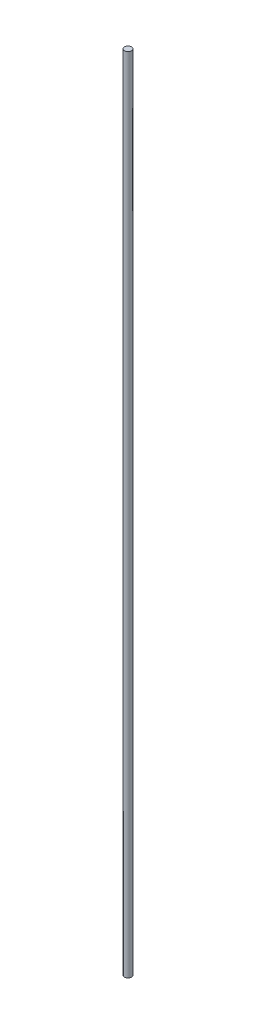
ISO-10303-21;
HEADER;
FILE_DESCRIPTION(('STEP AP214'),'2;1');
FILE_NAME('part.step','',(''),(''),'','','');
FILE_SCHEMA(('AUTOMOTIVE_DESIGN { 1 0 10303 214 1 1 1 1 }'));
ENDSEC;
DATA;
#1=APPLICATION_CONTEXT('core data for automotive mechanical design processes');
#2=APPLICATION_PROTOCOL_DEFINITION('international standard','automotive_design',2000,#1);
#3=PRODUCT_CONTEXT('',#1,'mechanical');
#4=PRODUCT('Part','Part','',(#3));
#5=PRODUCT_RELATED_PRODUCT_CATEGORY('part','',(#4));
#6=PRODUCT_DEFINITION_FORMATION('','',#4);
#7=PRODUCT_DEFINITION_CONTEXT('part definition',#1,'design');
#8=PRODUCT_DEFINITION('design','',#6,#7);
#9=PRODUCT_DEFINITION_SHAPE('','',#8);
#10=(LENGTH_UNIT() NAMED_UNIT(*) SI_UNIT(.MILLI.,.METRE.));
#11=(NAMED_UNIT(*) PLANE_ANGLE_UNIT() SI_UNIT($,.RADIAN.));
#12=(NAMED_UNIT(*) SI_UNIT($,.STERADIAN.) SOLID_ANGLE_UNIT());
#13=UNCERTAINTY_MEASURE_WITH_UNIT(LENGTH_MEASURE(1.E-05),#10,'distance_accuracy_value','');
#14=(GEOMETRIC_REPRESENTATION_CONTEXT(3) GLOBAL_UNCERTAINTY_ASSIGNED_CONTEXT((#13)) GLOBAL_UNIT_ASSIGNED_CONTEXT((#10,
#11,#12)) REPRESENTATION_CONTEXT('',''));
#15=CARTESIAN_POINT('',(0.,0.,0.));
#16=DIRECTION('',(0.,0.,1.));
#17=DIRECTION('',(1.,0.,0.));
#18=AXIS2_PLACEMENT_3D('',#15,#16,#17);
#19=CARTESIAN_POINT('',(0.,730.25,0.));
#20=DIRECTION('',(0.,-1.,0.));
#21=DIRECTION('',(0.,0.,-1.));
#22=AXIS2_PLACEMENT_3D('',#19,#20,#21);
#23=CYLINDRICAL_SURFACE('',#22,3.175);
#24=CARTESIAN_POINT('',(0.,730.25,0.));
#25=DIRECTION('',(0.,1.,0.));
#26=DIRECTION('',(0.,0.,1.));
#27=AXIS2_PLACEMENT_3D('',#24,#25,#26);
#28=CIRCLE('',#27,3.175);
#29=CARTESIAN_POINT('',(0.,730.25,3.175));
#30=VERTEX_POINT('',#29);
#31=EDGE_CURVE('E10',#30,#30,#28,.T.);
#32=ORIENTED_EDGE('',*,*,#31,.F.);
#33=EDGE_LOOP('',(#32));
#34=FACE_BOUND('',#33,.T.);
#35=CARTESIAN_POINT('',(0.,0.,0.));
#36=DIRECTION('',(0.,1.,0.));
#37=DIRECTION('',(0.,0.,1.));
#38=AXIS2_PLACEMENT_3D('',#35,#36,#37);
#39=CIRCLE('',#38,3.175);
#40=CARTESIAN_POINT('',(0.,0.,3.175));
#41=VERTEX_POINT('',#40);
#42=EDGE_CURVE('E40',#41,#41,#39,.T.);
#43=ORIENTED_EDGE('',*,*,#42,.T.);
#44=EDGE_LOOP('',(#43));
#45=FACE_BOUND('',#44,.T.);
#46=ADVANCED_FACE('F37',(#34,#45),#23,.T.);
#47=CARTESIAN_POINT('',(0.,730.25,0.));
#48=DIRECTION('',(0.,1.,0.));
#49=DIRECTION('',(0.,0.,1.));
#50=AXIS2_PLACEMENT_3D('',#47,#48,#49);
#51=PLANE('',#50);
#52=ORIENTED_EDGE('',*,*,#31,.T.);
#53=EDGE_LOOP('',(#52));
#54=FACE_BOUND('',#53,.T.);
#55=ADVANCED_FACE('F52',(#54),#51,.T.);
#56=CARTESIAN_POINT('',(0.,0.,0.));
#57=DIRECTION('',(0.,1.,0.));
#58=DIRECTION('',(0.,0.,1.));
#59=AXIS2_PLACEMENT_3D('',#56,#57,#58);
#60=PLANE('',#59);
#61=ORIENTED_EDGE('',*,*,#42,.F.);
#62=EDGE_LOOP('',(#61));
#63=FACE_BOUND('',#62,.T.);
#64=ADVANCED_FACE('F50',(#63),#60,.F.);
#65=CLOSED_SHELL('',(#46,#55,#64));
#66=MANIFOLD_SOLID_BREP('B2',#65);
#67=ADVANCED_BREP_SHAPE_REPRESENTATION('',(#18,#66),#14);
#68=SHAPE_DEFINITION_REPRESENTATION(#9,#67);
ENDSEC;
END-ISO-10303-21;
